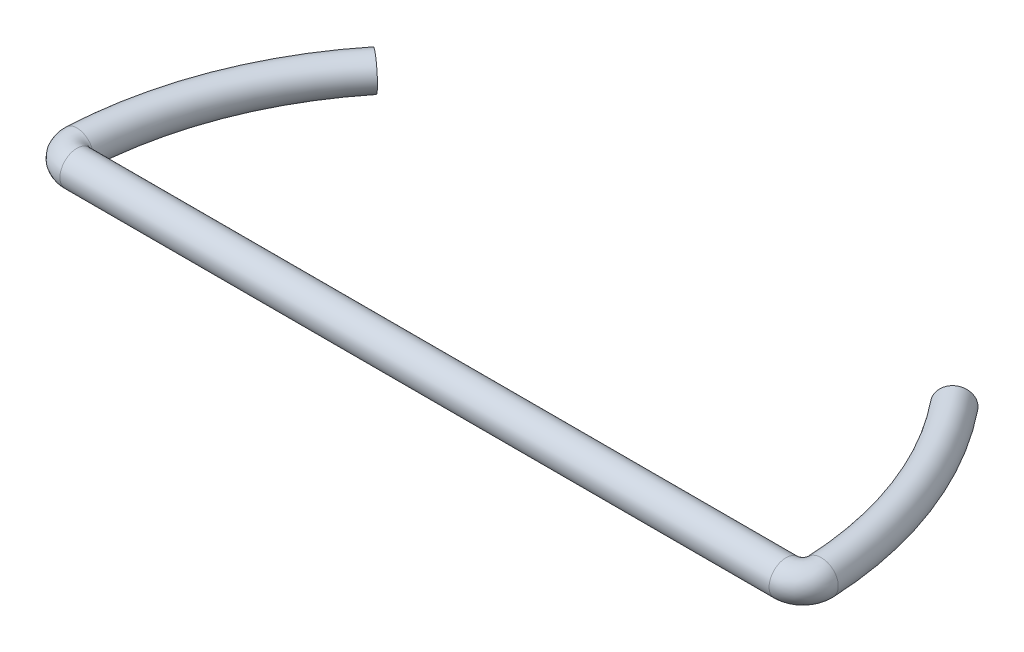
ISO-10303-21;
HEADER;
FILE_DESCRIPTION(('STEP AP214'),'2;1');
FILE_NAME('part.step','',(''),(''),'','','');
FILE_SCHEMA(('AUTOMOTIVE_DESIGN { 1 0 10303 214 1 1 1 1 }'));
ENDSEC;
DATA;
#1=APPLICATION_CONTEXT('core data for automotive mechanical design processes');
#2=APPLICATION_PROTOCOL_DEFINITION('international standard','automotive_design',2000,#1);
#3=PRODUCT_CONTEXT('',#1,'mechanical');
#4=PRODUCT('Part','Part','',(#3));
#5=PRODUCT_RELATED_PRODUCT_CATEGORY('part','',(#4));
#6=PRODUCT_DEFINITION_FORMATION('','',#4);
#7=PRODUCT_DEFINITION_CONTEXT('part definition',#1,'design');
#8=PRODUCT_DEFINITION('design','',#6,#7);
#9=PRODUCT_DEFINITION_SHAPE('','',#8);
#10=(LENGTH_UNIT() NAMED_UNIT(*) SI_UNIT(.MILLI.,.METRE.));
#11=(NAMED_UNIT(*) PLANE_ANGLE_UNIT() SI_UNIT($,.RADIAN.));
#12=(NAMED_UNIT(*) SI_UNIT($,.STERADIAN.) SOLID_ANGLE_UNIT());
#13=UNCERTAINTY_MEASURE_WITH_UNIT(LENGTH_MEASURE(1.E-05),#10,'distance_accuracy_value','');
#14=(GEOMETRIC_REPRESENTATION_CONTEXT(3) GLOBAL_UNCERTAINTY_ASSIGNED_CONTEXT((#13)) GLOBAL_UNIT_ASSIGNED_CONTEXT((#10,
#11,#12)) REPRESENTATION_CONTEXT('',''));
#15=CARTESIAN_POINT('',(0.,0.,0.));
#16=DIRECTION('',(0.,0.,1.));
#17=DIRECTION('',(1.,0.,0.));
#18=AXIS2_PLACEMENT_3D('',#15,#16,#17);
#19=CARTESIAN_POINT('',(0.,0.,0.));
#20=DIRECTION('',(0.,-1.,0.));
#21=DIRECTION('',(0.,0.,-1.));
#22=AXIS2_PLACEMENT_3D('',#19,#20,#21);
#23=TOROIDAL_SURFACE('',#22,33.,1.5);
#24=CARTESIAN_POINT('',(-25.7085271787131,0.,-20.6898919838014));
#25=DIRECTION('',(-0.626966423751565,0.,0.779046278142815));
#26=DIRECTION('',(0.779046278142815,0.,0.626966423751565));
#27=AXIS2_PLACEMENT_3D('',#24,#25,#26);
#28=CIRCLE('',#27,1.5);
#29=CARTESIAN_POINT('',(-24.5399577614989,0.,-19.7494423481741));
#30=VERTEX_POINT('',#29);
#31=EDGE_CURVE('E11',#30,#30,#28,.T.);
#32=ORIENTED_EDGE('',*,*,#31,.T.);
#33=EDGE_LOOP('',(#32));
#34=FACE_BOUND('',#33,.T.);
#35=CARTESIAN_POINT('',(-32.9625637996333,0.,-1.57142857142858));
#36=DIRECTION('',(-0.0476190476190567,0.,0.998865569685858));
#37=DIRECTION('',(0.998865569685858,0.,0.0476190476190567));
#38=AXIS2_PLACEMENT_3D('',#35,#36,#37);
#39=CIRCLE('',#38,1.5);
#40=CARTESIAN_POINT('',(-31.4642654451045,0.,-1.5));
#41=VERTEX_POINT('',#40);
#42=EDGE_CURVE('E40',#41,#41,#39,.T.);
#43=ORIENTED_EDGE('',*,*,#42,.F.);
#44=EDGE_LOOP('',(#43));
#45=FACE_BOUND('',#44,.T.);
#46=ADVANCED_FACE('F33',(#34,#45),#23,.T.);
#47=CARTESIAN_POINT('',(-31.4642654451045,0.,-3.));
#48=DIRECTION('',(-1.,0.,0.));
#49=DIRECTION('',(0.,0.,-1.));
#50=AXIS2_PLACEMENT_3D('',#47,#48,#49);
#51=CIRCLE('',#50,1.5);
#52=TRIMMED_CURVE('',#51,(PARAMETER_VALUE(-3.14159263868863)),
(PARAMETER_VALUE(3.14159263868863)),.T.,.PARAMETER.);
#53=CARTESIAN_POINT('',(-31.4642654451045,0.,-1.5));
#54=DIRECTION('',(0.,-1.,0.));
#55=AXIS1_PLACEMENT('',#53,#54);
#56=SURFACE_OF_REVOLUTION('',#52,#55);
#57=CARTESIAN_POINT('',(-31.4642654451045,0.,0.));
#58=DIRECTION('',(1.,0.,0.));
#59=DIRECTION('',(0.,0.,-1.));
#60=AXIS2_PLACEMENT_3D('',#57,#58,#59);
#61=CIRCLE('',#60,1.5);
#62=EDGE_CURVE('E63',#41,#41,#61,.T.);
#63=ORIENTED_EDGE('',*,*,#62,.F.);
#64=ORIENTED_EDGE('',*,*,#42,.T.);
#65=EDGE_LOOP('',(#63,#64));
#66=FACE_BOUND('',#65,.T.);
#67=ADVANCED_FACE('F66',(#66),#56,.T.);
#68=CARTESIAN_POINT('',(-31.4642654451045,0.,0.));
#69=DIRECTION('',(1.,0.,0.));
#70=DIRECTION('',(0.,0.,-1.));
#71=AXIS2_PLACEMENT_3D('',#68,#69,#70);
#72=CYLINDRICAL_SURFACE('',#71,1.5);
#73=ORIENTED_EDGE('',*,*,#62,.T.);
#74=EDGE_LOOP('',(#73));
#75=FACE_BOUND('',#74,.T.);
#76=CARTESIAN_POINT('',(31.4642654451045,0.,0.));
#77=DIRECTION('',(1.,0.,0.));
#78=DIRECTION('',(0.,0.,-1.));
#79=AXIS2_PLACEMENT_3D('',#76,#77,#78);
#80=CIRCLE('',#79,1.5);
#81=CARTESIAN_POINT('',(31.4642654451045,0.,-1.5));
#82=VERTEX_POINT('',#81);
#83=EDGE_CURVE('E55',#82,#82,#80,.T.);
#84=ORIENTED_EDGE('',*,*,#83,.F.);
#85=EDGE_LOOP('',(#84));
#86=FACE_BOUND('',#85,.T.);
#87=ADVANCED_FACE('F68',(#75,#86),#72,.T.);
#88=CARTESIAN_POINT('',(-25.7085271787131,0.,-20.6898919838014));
#89=DIRECTION('',(-0.626966423751565,0.,0.779046278142815));
#90=DIRECTION('',(0.779046278142815,0.,0.626966423751565));
#91=AXIS2_PLACEMENT_3D('',#88,#89,#90);
#92=PLANE('',#91);
#93=ORIENTED_EDGE('',*,*,#31,.F.);
#94=EDGE_LOOP('',(#93));
#95=FACE_BOUND('',#94,.T.);
#96=ADVANCED_FACE('F70',(#95),#92,.F.);
#97=CARTESIAN_POINT('',(0.,0.,0.));
#98=DIRECTION('',(0.,1.,0.));
#99=DIRECTION('',(0.,0.,1.));
#100=AXIS2_PLACEMENT_3D('',#97,#98,#99);
#101=TOROIDAL_SURFACE('',#100,33.,1.5);
#102=CARTESIAN_POINT('',(25.7085271787131,0.,-20.6898919838014));
#103=DIRECTION('',(-0.626966423751565,0.,-0.779046278142815));
#104=DIRECTION('',(-0.779046278142815,0.,0.626966423751565));
#105=AXIS2_PLACEMENT_3D('',#102,#103,#104);
#106=CIRCLE('',#105,1.5);
#107=CARTESIAN_POINT('',(24.5399577614989,0.,-19.7494423481741));
#108=VERTEX_POINT('',#107);
#109=EDGE_CURVE('E54',#108,#108,#106,.T.);
#110=ORIENTED_EDGE('',*,*,#109,.F.);
#111=EDGE_LOOP('',(#110));
#112=FACE_BOUND('',#111,.T.);
#113=CARTESIAN_POINT('',(32.9625637996333,0.,-1.57142857142858));
#114=DIRECTION('',(-0.0476190476190567,0.,-0.998865569685858));
#115=DIRECTION('',(-0.998865569685858,0.,0.0476190476190567));
#116=AXIS2_PLACEMENT_3D('',#113,#114,#115);
#117=CIRCLE('',#116,1.5);
#118=EDGE_CURVE('E49',#82,#82,#117,.T.);
#119=ORIENTED_EDGE('',*,*,#118,.T.);
#120=EDGE_LOOP('',(#119));
#121=FACE_BOUND('',#120,.T.);
#122=ADVANCED_FACE('F51',(#112,#121),#101,.T.);
#123=CARTESIAN_POINT('',(31.4642654451045,0.,0.));
#124=DIRECTION('',(-1.,0.,0.));
#125=DIRECTION('',(0.,0.,1.));
#126=AXIS2_PLACEMENT_3D('',#123,#124,#125);
#127=CIRCLE('',#126,1.5);
#128=TRIMMED_CURVE('',#127,(PARAMETER_VALUE(-3.14159263868863)),
(PARAMETER_VALUE(3.14159263868863)),.T.,.PARAMETER.);
#129=CARTESIAN_POINT('',(31.4642654451045,0.,-1.5));
#130=DIRECTION('',(0.,1.,0.));
#131=AXIS1_PLACEMENT('',#129,#130);
#132=SURFACE_OF_REVOLUTION('',#128,#131);
#133=ORIENTED_EDGE('',*,*,#83,.T.);
#134=ORIENTED_EDGE('',*,*,#118,.F.);
#135=EDGE_LOOP('',(#133,#134));
#136=FACE_BOUND('',#135,.T.);
#137=ADVANCED_FACE('F57',(#136),#132,.T.);
#138=CARTESIAN_POINT('',(25.7085271787131,0.,-20.6898919838014));
#139=DIRECTION('',(0.626966423751565,0.,0.779046278142815));
#140=DIRECTION('',(-0.779046278142815,0.,0.626966423751565));
#141=AXIS2_PLACEMENT_3D('',#138,#139,#140);
#142=PLANE('',#141);
#143=ORIENTED_EDGE('',*,*,#109,.T.);
#144=EDGE_LOOP('',(#143));
#145=FACE_BOUND('',#144,.T.);
#146=ADVANCED_FACE('F116',(#145),#142,.F.);
#147=CLOSED_SHELL('',(#46,#67,#87,#96,#122,#137,#146));
#148=MANIFOLD_SOLID_BREP('B2',#147);
#149=ADVANCED_BREP_SHAPE_REPRESENTATION('',(#18,#148),#14);
#150=SHAPE_DEFINITION_REPRESENTATION(#9,#149);
ENDSEC;
END-ISO-10303-21;
